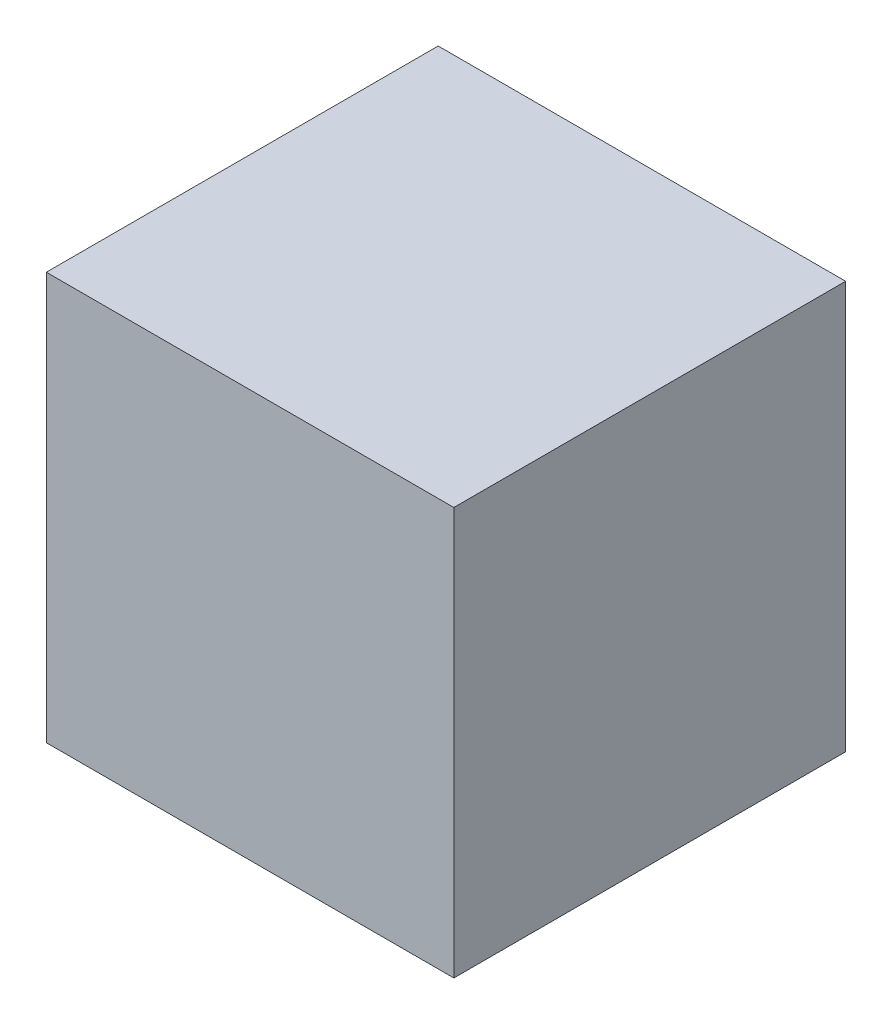
ISO-10303-21;
HEADER;
FILE_DESCRIPTION(('STEP AP214'),'2;1');
FILE_NAME('part.step','',(''),(''),'','','');
FILE_SCHEMA(('AUTOMOTIVE_DESIGN { 1 0 10303 214 1 1 1 1 }'));
ENDSEC;
DATA;
#1=APPLICATION_CONTEXT('core data for automotive mechanical design processes');
#2=APPLICATION_PROTOCOL_DEFINITION('international standard','automotive_design',2000,#1);
#3=PRODUCT_CONTEXT('',#1,'mechanical');
#4=PRODUCT('Part','Part','',(#3));
#5=PRODUCT_RELATED_PRODUCT_CATEGORY('part','',(#4));
#6=PRODUCT_DEFINITION_FORMATION('','',#4);
#7=PRODUCT_DEFINITION_CONTEXT('part definition',#1,'design');
#8=PRODUCT_DEFINITION('design','',#6,#7);
#9=PRODUCT_DEFINITION_SHAPE('','',#8);
#10=(LENGTH_UNIT() NAMED_UNIT(*) SI_UNIT(.MILLI.,.METRE.));
#11=(NAMED_UNIT(*) PLANE_ANGLE_UNIT() SI_UNIT($,.RADIAN.));
#12=(NAMED_UNIT(*) SI_UNIT($,.STERADIAN.) SOLID_ANGLE_UNIT());
#13=UNCERTAINTY_MEASURE_WITH_UNIT(LENGTH_MEASURE(1.E-05),#10,'distance_accuracy_value','');
#14=(GEOMETRIC_REPRESENTATION_CONTEXT(3) GLOBAL_UNCERTAINTY_ASSIGNED_CONTEXT((#13)) GLOBAL_UNIT_ASSIGNED_CONTEXT((#10,
#11,#12)) REPRESENTATION_CONTEXT('',''));
#15=CARTESIAN_POINT('',(0.,0.,0.));
#16=DIRECTION('',(0.,0.,1.));
#17=DIRECTION('',(1.,0.,0.));
#18=AXIS2_PLACEMENT_3D('',#15,#16,#17);
#19=CARTESIAN_POINT('',(3.30199999999999,3.30199999999999,0.));
#20=DIRECTION('',(0.,0.,-1.));
#21=DIRECTION('',(-1.,0.,0.));
#22=AXIS2_PLACEMENT_3D('',#19,#20,#21);
#23=PLANE('',#22);
#24=DIRECTION('',(0.,1.,0.));
#25=VECTOR('',#24,1.);
#26=CARTESIAN_POINT('',(3.30199999999999,-3.30200000000001,0.));
#27=LINE('',#26,#25);
#28=CARTESIAN_POINT('',(3.30199999999999,-3.30200000000001,0.));
#29=VERTEX_POINT('',#28);
#30=CARTESIAN_POINT('',(3.30199999999999,3.30199999999999,0.));
#31=VERTEX_POINT('',#30);
#32=EDGE_CURVE('E95',#29,#31,#27,.T.);
#33=ORIENTED_EDGE('',*,*,#32,.F.);
#34=DIRECTION('',(1.,0.,0.));
#35=VECTOR('',#34,1.);
#36=CARTESIAN_POINT('',(-3.30200000000001,-3.30200000000001,0.));
#37=LINE('',#36,#35);
#38=CARTESIAN_POINT('',(-3.30200000000001,-3.30200000000001,0.));
#39=VERTEX_POINT('',#38);
#40=EDGE_CURVE('E71',#39,#29,#37,.T.);
#41=ORIENTED_EDGE('',*,*,#40,.F.);
#42=DIRECTION('',(0.,-1.,0.));
#43=VECTOR('',#42,1.);
#44=CARTESIAN_POINT('',(-3.30200000000001,-3.30200000000001,0.));
#45=LINE('',#44,#43);
#46=CARTESIAN_POINT('',(-3.30200000000001,3.30199999999999,0.));
#47=VERTEX_POINT('',#46);
#48=EDGE_CURVE('E65',#47,#39,#45,.T.);
#49=ORIENTED_EDGE('',*,*,#48,.F.);
#50=DIRECTION('',(-1.,0.,0.));
#51=VECTOR('',#50,1.);
#52=CARTESIAN_POINT('',(-3.30200000000001,3.30199999999999,0.));
#53=LINE('',#52,#51);
#54=EDGE_CURVE('E87',#31,#47,#53,.T.);
#55=ORIENTED_EDGE('',*,*,#54,.F.);
#56=EDGE_LOOP('',(#33,#41,#49,#55));
#57=FACE_BOUND('',#56,.T.);
#58=CARTESIAN_POINT('',(0.,0.,0.));
#59=DIRECTION('',(0.,0.,-1.));
#60=DIRECTION('',(-1.,0.,0.));
#61=AXIS2_PLACEMENT_3D('',#58,#59,#60);
#62=CIRCLE('',#61,0.8255);
#63=CARTESIAN_POINT('',(-0.8255,0.,0.));
#64=VERTEX_POINT('',#63);
#65=EDGE_CURVE('E109',#64,#64,#62,.T.);
#66=ORIENTED_EDGE('',*,*,#65,.F.);
#67=EDGE_LOOP('',(#66));
#68=FACE_BOUND('',#67,.T.);
#69=ADVANCED_FACE('F31',(#57,#68),#23,.T.);
#70=CARTESIAN_POINT('',(3.30199999999999,-3.30200000000001,6.35));
#71=DIRECTION('',(-1.,0.,0.));
#72=DIRECTION('',(0.,0.,1.));
#73=AXIS2_PLACEMENT_3D('',#70,#71,#72);
#74=PLANE('',#73);
#75=ORIENTED_EDGE('',*,*,#32,.T.);
#76=DIRECTION('',(0.,0.,-1.));
#77=VECTOR('',#76,1.);
#78=CARTESIAN_POINT('',(3.30199999999999,3.30199999999999,6.35));
#79=LINE('',#78,#77);
#80=CARTESIAN_POINT('',(3.30199999999999,3.30199999999999,6.35));
#81=VERTEX_POINT('',#80);
#82=EDGE_CURVE('E11',#81,#31,#79,.T.);
#83=ORIENTED_EDGE('',*,*,#82,.F.);
#84=DIRECTION('',(0.,1.,0.));
#85=VECTOR('',#84,1.);
#86=CARTESIAN_POINT('',(3.30199999999999,-3.30200000000001,6.35));
#87=LINE('',#86,#85);
#88=CARTESIAN_POINT('',(3.30199999999999,-3.30200000000001,6.35));
#89=VERTEX_POINT('',#88);
#90=EDGE_CURVE('E83',#89,#81,#87,.T.);
#91=ORIENTED_EDGE('',*,*,#90,.F.);
#92=DIRECTION('',(0.,0.,-1.));
#93=VECTOR('',#92,1.);
#94=CARTESIAN_POINT('',(3.30199999999999,-3.30200000000001,6.35));
#95=LINE('',#94,#93);
#96=EDGE_CURVE('E91',#89,#29,#95,.T.);
#97=ORIENTED_EDGE('',*,*,#96,.T.);
#98=EDGE_LOOP('',(#75,#83,#91,#97));
#99=FACE_BOUND('',#98,.T.);
#100=ADVANCED_FACE('F33',(#99),#74,.F.);
#101=CARTESIAN_POINT('',(-3.30200000000001,3.30199999999999,6.35));
#102=DIRECTION('',(0.,-1.,0.));
#103=DIRECTION('',(0.,0.,-1.));
#104=AXIS2_PLACEMENT_3D('',#101,#102,#103);
#105=PLANE('',#104);
#106=ORIENTED_EDGE('',*,*,#54,.T.);
#107=DIRECTION('',(0.,0.,-1.));
#108=VECTOR('',#107,1.);
#109=CARTESIAN_POINT('',(-3.30200000000001,3.30199999999999,6.35));
#110=LINE('',#109,#108);
#111=CARTESIAN_POINT('',(-3.30200000000001,3.30199999999999,6.35));
#112=VERTEX_POINT('',#111);
#113=EDGE_CURVE('E40',#112,#47,#110,.T.);
#114=ORIENTED_EDGE('',*,*,#113,.F.);
#115=DIRECTION('',(-1.,0.,0.));
#116=VECTOR('',#115,1.);
#117=CARTESIAN_POINT('',(-3.30200000000001,3.30199999999999,6.35));
#118=LINE('',#117,#116);
#119=EDGE_CURVE('E78',#81,#112,#118,.T.);
#120=ORIENTED_EDGE('',*,*,#119,.F.);
#121=ORIENTED_EDGE('',*,*,#82,.T.);
#122=EDGE_LOOP('',(#106,#114,#120,#121));
#123=FACE_BOUND('',#122,.T.);
#124=ADVANCED_FACE('F86',(#123),#105,.F.);
#125=CARTESIAN_POINT('',(-3.30200000000001,-3.30200000000001,6.35));
#126=DIRECTION('',(1.,0.,0.));
#127=DIRECTION('',(0.,0.,-1.));
#128=AXIS2_PLACEMENT_3D('',#125,#126,#127);
#129=PLANE('',#128);
#130=ORIENTED_EDGE('',*,*,#48,.T.);
#131=DIRECTION('',(0.,0.,-1.));
#132=VECTOR('',#131,1.);
#133=CARTESIAN_POINT('',(-3.30200000000001,-3.30200000000001,6.35));
#134=LINE('',#133,#132);
#135=CARTESIAN_POINT('',(-3.30200000000001,-3.30200000000001,6.35));
#136=VERTEX_POINT('',#135);
#137=EDGE_CURVE('E88',#136,#39,#134,.T.);
#138=ORIENTED_EDGE('',*,*,#137,.F.);
#139=DIRECTION('',(0.,-1.,0.));
#140=VECTOR('',#139,1.);
#141=CARTESIAN_POINT('',(-3.30200000000001,-3.30200000000001,6.35));
#142=LINE('',#141,#140);
#143=EDGE_CURVE('E81',#112,#136,#142,.T.);
#144=ORIENTED_EDGE('',*,*,#143,.F.);
#145=ORIENTED_EDGE('',*,*,#113,.T.);
#146=EDGE_LOOP('',(#130,#138,#144,#145));
#147=FACE_BOUND('',#146,.T.);
#148=ADVANCED_FACE('F89',(#147),#129,.F.);
#149=CARTESIAN_POINT('',(-3.30200000000001,-3.30200000000001,6.35));
#150=DIRECTION('',(0.,1.,0.));
#151=DIRECTION('',(0.,0.,1.));
#152=AXIS2_PLACEMENT_3D('',#149,#150,#151);
#153=PLANE('',#152);
#154=ORIENTED_EDGE('',*,*,#40,.T.);
#155=ORIENTED_EDGE('',*,*,#96,.F.);
#156=DIRECTION('',(1.,0.,0.));
#157=VECTOR('',#156,1.);
#158=CARTESIAN_POINT('',(-3.30200000000001,-3.30200000000001,6.35));
#159=LINE('',#158,#157);
#160=EDGE_CURVE('E48',#136,#89,#159,.T.);
#161=ORIENTED_EDGE('',*,*,#160,.F.);
#162=ORIENTED_EDGE('',*,*,#137,.T.);
#163=EDGE_LOOP('',(#154,#155,#161,#162));
#164=FACE_BOUND('',#163,.T.);
#165=ADVANCED_FACE('F103',(#164),#153,.F.);
#166=CARTESIAN_POINT('',(3.30199999999999,3.30199999999999,6.35));
#167=DIRECTION('',(0.,0.,-1.));
#168=DIRECTION('',(-1.,0.,0.));
#169=AXIS2_PLACEMENT_3D('',#166,#167,#168);
#170=PLANE('',#169);
#171=ORIENTED_EDGE('',*,*,#90,.T.);
#172=ORIENTED_EDGE('',*,*,#119,.T.);
#173=ORIENTED_EDGE('',*,*,#143,.T.);
#174=ORIENTED_EDGE('',*,*,#160,.T.);
#175=EDGE_LOOP('',(#171,#172,#173,#174));
#176=FACE_BOUND('',#175,.T.);
#177=ADVANCED_FACE('F79',(#176),#170,.F.);
#178=CARTESIAN_POINT('',(0.,0.,-1.27));
#179=DIRECTION('',(0.,0.,1.));
#180=DIRECTION('',(1.,0.,0.));
#181=AXIS2_PLACEMENT_3D('',#178,#179,#180);
#182=CYLINDRICAL_SURFACE('',#181,0.8255);
#183=CARTESIAN_POINT('',(0.,0.,-1.27));
#184=DIRECTION('',(0.,0.,-1.));
#185=DIRECTION('',(-1.,0.,0.));
#186=AXIS2_PLACEMENT_3D('',#183,#184,#185);
#187=CIRCLE('',#186,0.8255);
#188=CARTESIAN_POINT('',(-0.8255,0.,-1.27));
#189=VERTEX_POINT('',#188);
#190=EDGE_CURVE('E98',#189,#189,#187,.T.);
#191=ORIENTED_EDGE('',*,*,#190,.F.);
#192=EDGE_LOOP('',(#191));
#193=FACE_BOUND('',#192,.T.);
#194=ORIENTED_EDGE('',*,*,#65,.T.);
#195=EDGE_LOOP('',(#194));
#196=FACE_BOUND('',#195,.T.);
#197=ADVANCED_FACE('F117',(#193,#196),#182,.T.);
#198=CARTESIAN_POINT('',(0.,0.,-1.27));
#199=DIRECTION('',(0.,0.,-1.));
#200=DIRECTION('',(-1.,0.,0.));
#201=AXIS2_PLACEMENT_3D('',#198,#199,#200);
#202=PLANE('',#201);
#203=ORIENTED_EDGE('',*,*,#190,.T.);
#204=EDGE_LOOP('',(#203));
#205=FACE_BOUND('',#204,.T.);
#206=ADVANCED_FACE('F115',(#205),#202,.T.);
#207=CLOSED_SHELL('',(#69,#100,#124,#148,#165,#177,#197,#206));
#208=MANIFOLD_SOLID_BREP('B2',#207);
#209=ADVANCED_BREP_SHAPE_REPRESENTATION('',(#18,#208),#14);
#210=SHAPE_DEFINITION_REPRESENTATION(#9,#209);
ENDSEC;
END-ISO-10303-21;
